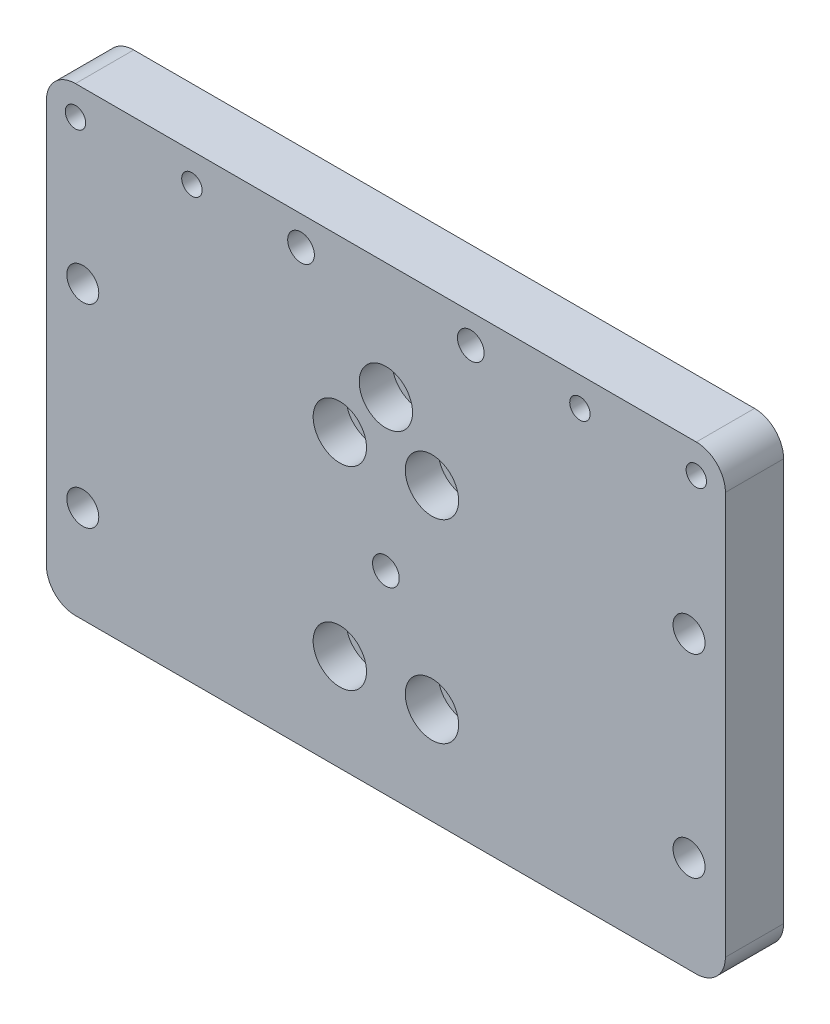
ISO-10303-21;
HEADER;
FILE_DESCRIPTION(('STEP AP214'),'2;1');
FILE_NAME('part.step','',(''),(''),'','','');
FILE_SCHEMA(('AUTOMOTIVE_DESIGN { 1 0 10303 214 1 1 1 1 }'));
ENDSEC;
DATA;
#1=APPLICATION_CONTEXT('core data for automotive mechanical design processes');
#2=APPLICATION_PROTOCOL_DEFINITION('international standard','automotive_design',2000,#1);
#3=PRODUCT_CONTEXT('',#1,'mechanical');
#4=PRODUCT('Part','Part','',(#3));
#5=PRODUCT_RELATED_PRODUCT_CATEGORY('part','',(#4));
#6=PRODUCT_DEFINITION_FORMATION('','',#4);
#7=PRODUCT_DEFINITION_CONTEXT('part definition',#1,'design');
#8=PRODUCT_DEFINITION('design','',#6,#7);
#9=PRODUCT_DEFINITION_SHAPE('','',#8);
#10=(LENGTH_UNIT() NAMED_UNIT(*) SI_UNIT(.MILLI.,.METRE.));
#11=(NAMED_UNIT(*) PLANE_ANGLE_UNIT() SI_UNIT($,.RADIAN.));
#12=(NAMED_UNIT(*) SI_UNIT($,.STERADIAN.) SOLID_ANGLE_UNIT());
#13=UNCERTAINTY_MEASURE_WITH_UNIT(LENGTH_MEASURE(1.E-05),#10,'distance_accuracy_value','');
#14=(GEOMETRIC_REPRESENTATION_CONTEXT(3) GLOBAL_UNCERTAINTY_ASSIGNED_CONTEXT((#13)) GLOBAL_UNIT_ASSIGNED_CONTEXT((#10,
#11,#12)) REPRESENTATION_CONTEXT('',''));
#15=CARTESIAN_POINT('',(0.,0.,0.));
#16=DIRECTION('',(0.,0.,1.));
#17=DIRECTION('',(1.,0.,0.));
#18=AXIS2_PLACEMENT_3D('',#15,#16,#17);
#19=CARTESIAN_POINT('',(0.,23.5,-6.));
#20=DIRECTION('',(0.,0.,1.));
#21=DIRECTION('',(1.,0.,0.));
#22=AXIS2_PLACEMENT_3D('',#19,#20,#21);
#23=CYLINDRICAL_SURFACE('',#22,2.75);
#24=CARTESIAN_POINT('',(0.,23.5,-6.));
#25=DIRECTION('',(0.,0.,1.));
#26=DIRECTION('',(1.,0.,0.));
#27=AXIS2_PLACEMENT_3D('',#24,#25,#26);
#28=CIRCLE('',#27,2.75);
#29=CARTESIAN_POINT('',(2.75000000000001,23.5,-6.));
#30=VERTEX_POINT('',#29);
#31=EDGE_CURVE('E184',#30,#30,#28,.T.);
#32=ORIENTED_EDGE('',*,*,#31,.F.);
#33=EDGE_LOOP('',(#32));
#34=FACE_BOUND('',#33,.T.);
#35=CARTESIAN_POINT('',(0.,23.5,-0.799999999999999));
#36=DIRECTION('',(0.,0.,1.));
#37=DIRECTION('',(1.,0.,0.));
#38=AXIS2_PLACEMENT_3D('',#35,#36,#37);
#39=CIRCLE('',#38,2.75);
#40=CARTESIAN_POINT('',(2.75000000000001,23.5,-0.799999999999999));
#41=VERTEX_POINT('',#40);
#42=EDGE_CURVE('E150',#41,#41,#39,.F.);
#43=ORIENTED_EDGE('',*,*,#42,.F.);
#44=EDGE_LOOP('',(#43));
#45=FACE_BOUND('',#44,.T.);
#46=ADVANCED_FACE('F35',(#34,#45),#23,.F.);
#47=CARTESIAN_POINT('',(-9.49999999999999,12.5,-6.));
#48=DIRECTION('',(0.,0.,1.));
#49=DIRECTION('',(1.,0.,0.));
#50=AXIS2_PLACEMENT_3D('',#47,#48,#49);
#51=CYLINDRICAL_SURFACE('',#50,3.3);
#52=CARTESIAN_POINT('',(-9.49999999999999,12.5,-6.));
#53=DIRECTION('',(0.,0.,1.));
#54=DIRECTION('',(1.,0.,0.));
#55=AXIS2_PLACEMENT_3D('',#52,#53,#54);
#56=CIRCLE('',#55,3.3);
#57=CARTESIAN_POINT('',(-6.19999999999999,12.5,-6.));
#58=VERTEX_POINT('',#57);
#59=EDGE_CURVE('E223',#58,#58,#56,.T.);
#60=ORIENTED_EDGE('',*,*,#59,.F.);
#61=EDGE_LOOP('',(#60));
#62=FACE_BOUND('',#61,.T.);
#63=CARTESIAN_POINT('',(-9.49999999999999,12.5,-0.799999999999999));
#64=DIRECTION('',(0.,0.,1.));
#65=DIRECTION('',(1.,0.,0.));
#66=AXIS2_PLACEMENT_3D('',#63,#64,#65);
#67=CIRCLE('',#66,3.3);
#68=CARTESIAN_POINT('',(-6.19999999999999,12.5,-0.799999999999999));
#69=VERTEX_POINT('',#68);
#70=EDGE_CURVE('E147',#69,#69,#67,.F.);
#71=ORIENTED_EDGE('',*,*,#70,.F.);
#72=EDGE_LOOP('',(#71));
#73=FACE_BOUND('',#72,.T.);
#74=ADVANCED_FACE('F355',(#62,#73),#51,.F.);
#75=CARTESIAN_POINT('',(9.50000000000001,12.5,-6.));
#76=DIRECTION('',(0.,0.,1.));
#77=DIRECTION('',(1.,0.,0.));
#78=AXIS2_PLACEMENT_3D('',#75,#76,#77);
#79=CYLINDRICAL_SURFACE('',#78,3.3);
#80=CARTESIAN_POINT('',(9.50000000000001,12.5,-6.));
#81=DIRECTION('',(0.,0.,1.));
#82=DIRECTION('',(-1.,0.,0.));
#83=AXIS2_PLACEMENT_3D('',#80,#81,#82);
#84=CIRCLE('',#83,3.3);
#85=CARTESIAN_POINT('',(6.20000000000001,12.5,-6.));
#86=VERTEX_POINT('',#85);
#87=EDGE_CURVE('E138',#86,#86,#84,.T.);
#88=ORIENTED_EDGE('',*,*,#87,.F.);
#89=EDGE_LOOP('',(#88));
#90=FACE_BOUND('',#89,.T.);
#91=CARTESIAN_POINT('',(9.50000000000001,12.5,-0.799999999999999));
#92=DIRECTION('',(0.,0.,1.));
#93=DIRECTION('',(1.,0.,0.));
#94=AXIS2_PLACEMENT_3D('',#91,#92,#93);
#95=CIRCLE('',#94,3.3);
#96=CARTESIAN_POINT('',(12.8,12.5,-0.799999999999999));
#97=VERTEX_POINT('',#96);
#98=EDGE_CURVE('E143',#97,#97,#95,.F.);
#99=ORIENTED_EDGE('',*,*,#98,.F.);
#100=EDGE_LOOP('',(#99));
#101=FACE_BOUND('',#100,.T.);
#102=ADVANCED_FACE('F361',(#90,#101),#79,.F.);
#103=CARTESIAN_POINT('',(9.50000000000001,-27.5,-6.));
#104=DIRECTION('',(0.,0.,1.));
#105=DIRECTION('',(1.,0.,0.));
#106=AXIS2_PLACEMENT_3D('',#103,#104,#105);
#107=CYLINDRICAL_SURFACE('',#106,3.3);
#108=CARTESIAN_POINT('',(9.50000000000001,-27.5,-6.));
#109=DIRECTION('',(0.,0.,1.));
#110=DIRECTION('',(-1.,0.,0.));
#111=AXIS2_PLACEMENT_3D('',#108,#109,#110);
#112=CIRCLE('',#111,3.3);
#113=CARTESIAN_POINT('',(6.20000000000001,-27.5,-6.));
#114=VERTEX_POINT('',#113);
#115=EDGE_CURVE('E257',#114,#114,#112,.T.);
#116=ORIENTED_EDGE('',*,*,#115,.F.);
#117=EDGE_LOOP('',(#116));
#118=FACE_BOUND('',#117,.T.);
#119=CARTESIAN_POINT('',(9.50000000000001,-27.5,-0.799999999999999));
#120=DIRECTION('',(0.,0.,1.));
#121=DIRECTION('',(1.,0.,0.));
#122=AXIS2_PLACEMENT_3D('',#119,#120,#121);
#123=CIRCLE('',#122,3.3);
#124=CARTESIAN_POINT('',(12.8,-27.5,-0.799999999999999));
#125=VERTEX_POINT('',#124);
#126=EDGE_CURVE('E140',#125,#125,#123,.F.);
#127=ORIENTED_EDGE('',*,*,#126,.F.);
#128=EDGE_LOOP('',(#127));
#129=FACE_BOUND('',#128,.T.);
#130=ADVANCED_FACE('F513',(#118,#129),#107,.F.);
#131=CARTESIAN_POINT('',(-9.49999999999999,-27.5,-6.));
#132=DIRECTION('',(0.,0.,1.));
#133=DIRECTION('',(1.,0.,0.));
#134=AXIS2_PLACEMENT_3D('',#131,#132,#133);
#135=CYLINDRICAL_SURFACE('',#134,3.3);
#136=CARTESIAN_POINT('',(-9.49999999999999,-27.5,-6.));
#137=DIRECTION('',(0.,0.,1.));
#138=DIRECTION('',(1.,0.,0.));
#139=AXIS2_PLACEMENT_3D('',#136,#137,#138);
#140=CIRCLE('',#139,3.3);
#141=CARTESIAN_POINT('',(-6.19999999999999,-27.5,-6.));
#142=VERTEX_POINT('',#141);
#143=EDGE_CURVE('E220',#142,#142,#140,.T.);
#144=ORIENTED_EDGE('',*,*,#143,.F.);
#145=EDGE_LOOP('',(#144));
#146=FACE_BOUND('',#145,.T.);
#147=CARTESIAN_POINT('',(-9.49999999999999,-27.5,-0.799999999999999));
#148=DIRECTION('',(0.,0.,1.));
#149=DIRECTION('',(1.,0.,0.));
#150=AXIS2_PLACEMENT_3D('',#147,#148,#149);
#151=CIRCLE('',#150,3.3);
#152=CARTESIAN_POINT('',(-6.19999999999999,-27.5,-0.799999999999999));
#153=VERTEX_POINT('',#152);
#154=EDGE_CURVE('E135',#153,#153,#151,.F.);
#155=ORIENTED_EDGE('',*,*,#154,.F.);
#156=EDGE_LOOP('',(#155));
#157=FACE_BOUND('',#156,.T.);
#158=ADVANCED_FACE('F382',(#146,#157),#135,.F.);
#159=CARTESIAN_POINT('',(-70.,-47.5,6.));
#160=DIRECTION('',(1.,0.,0.));
#161=DIRECTION('',(0.,0.,-1.));
#162=AXIS2_PLACEMENT_3D('',#159,#160,#161);
#163=PLANE('',#162);
#164=DIRECTION('',(0.,-1.,0.));
#165=VECTOR('',#164,1.);
#166=CARTESIAN_POINT('',(-70.,-47.5,-6.));
#167=LINE('',#166,#165);
#168=CARTESIAN_POINT('',(-70.,41.5,-6.));
#169=VERTEX_POINT('',#168);
#170=CARTESIAN_POINT('',(-70.,-41.5,-6.));
#171=VERTEX_POINT('',#170);
#172=EDGE_CURVE('E131',#169,#171,#167,.T.);
#173=ORIENTED_EDGE('',*,*,#172,.T.);
#174=DIRECTION('',(0.,0.,-1.));
#175=VECTOR('',#174,1.);
#176=CARTESIAN_POINT('',(-70.,-41.5,6.));
#177=LINE('',#176,#175);
#178=CARTESIAN_POINT('',(-70.,-41.5,6.));
#179=VERTEX_POINT('',#178);
#180=EDGE_CURVE('E11',#171,#179,#177,.F.);
#181=ORIENTED_EDGE('',*,*,#180,.T.);
#182=DIRECTION('',(0.,-1.,0.));
#183=VECTOR('',#182,1.);
#184=CARTESIAN_POINT('',(-70.,-47.5,6.));
#185=LINE('',#184,#183);
#186=CARTESIAN_POINT('',(-70.,41.5,6.));
#187=VERTEX_POINT('',#186);
#188=EDGE_CURVE('E129',#187,#179,#185,.T.);
#189=ORIENTED_EDGE('',*,*,#188,.F.);
#190=DIRECTION('',(0.,0.,-1.));
#191=VECTOR('',#190,1.);
#192=CARTESIAN_POINT('',(-70.,41.5,6.));
#193=LINE('',#192,#191);
#194=EDGE_CURVE('E43',#187,#169,#193,.T.);
#195=ORIENTED_EDGE('',*,*,#194,.T.);
#196=EDGE_LOOP('',(#173,#181,#189,#195));
#197=FACE_BOUND('',#196,.T.);
#198=ADVANCED_FACE('F179',(#197),#163,.F.);
#199=CARTESIAN_POINT('',(70.,-47.5,6.));
#200=DIRECTION('',(0.,1.,0.));
#201=DIRECTION('',(-1.,0.,0.));
#202=AXIS2_PLACEMENT_3D('',#199,#200,#201);
#203=PLANE('',#202);
#204=DIRECTION('',(1.,0.,0.));
#205=VECTOR('',#204,1.);
#206=CARTESIAN_POINT('',(70.,-47.5,-6.));
#207=LINE('',#206,#205);
#208=CARTESIAN_POINT('',(-64.,-47.5,-6.));
#209=VERTEX_POINT('',#208);
#210=CARTESIAN_POINT('',(64.,-47.5,-6.));
#211=VERTEX_POINT('',#210);
#212=EDGE_CURVE('E127',#209,#211,#207,.T.);
#213=ORIENTED_EDGE('',*,*,#212,.T.);
#214=DIRECTION('',(0.,0.,-1.));
#215=VECTOR('',#214,1.);
#216=CARTESIAN_POINT('',(64.,-47.5,6.));
#217=LINE('',#216,#215);
#218=CARTESIAN_POINT('',(64.,-47.5,6.));
#219=VERTEX_POINT('',#218);
#220=EDGE_CURVE('E106',#211,#219,#217,.F.);
#221=ORIENTED_EDGE('',*,*,#220,.T.);
#222=DIRECTION('',(1.,0.,0.));
#223=VECTOR('',#222,1.);
#224=CARTESIAN_POINT('',(70.,-47.5,6.));
#225=LINE('',#224,#223);
#226=CARTESIAN_POINT('',(-64.,-47.5,6.));
#227=VERTEX_POINT('',#226);
#228=EDGE_CURVE('E191',#227,#219,#225,.T.);
#229=ORIENTED_EDGE('',*,*,#228,.F.);
#230=DIRECTION('',(0.,0.,-1.));
#231=VECTOR('',#230,1.);
#232=CARTESIAN_POINT('',(-64.,-47.5,6.));
#233=LINE('',#232,#231);
#234=EDGE_CURVE('E111',#227,#209,#233,.T.);
#235=ORIENTED_EDGE('',*,*,#234,.T.);
#236=EDGE_LOOP('',(#213,#221,#229,#235));
#237=FACE_BOUND('',#236,.T.);
#238=ADVANCED_FACE('F346',(#237),#203,.F.);
#239=CARTESIAN_POINT('',(70.,-47.5,6.));
#240=DIRECTION('',(-1.,0.,0.));
#241=DIRECTION('',(0.,0.,1.));
#242=AXIS2_PLACEMENT_3D('',#239,#240,#241);
#243=PLANE('',#242);
#244=DIRECTION('',(0.,1.,0.));
#245=VECTOR('',#244,1.);
#246=CARTESIAN_POINT('',(70.,-47.5,6.));
#247=LINE('',#246,#245);
#248=CARTESIAN_POINT('',(70.,-41.5,6.));
#249=VERTEX_POINT('',#248);
#250=CARTESIAN_POINT('',(70.,41.5,6.));
#251=VERTEX_POINT('',#250);
#252=EDGE_CURVE('E120',#249,#251,#247,.T.);
#253=ORIENTED_EDGE('',*,*,#252,.F.);
#254=DIRECTION('',(0.,0.,-1.));
#255=VECTOR('',#254,1.);
#256=CARTESIAN_POINT('',(70.,-41.5,6.));
#257=LINE('',#256,#255);
#258=CARTESIAN_POINT('',(70.,-41.5,-6.));
#259=VERTEX_POINT('',#258);
#260=EDGE_CURVE('E105',#249,#259,#257,.T.);
#261=ORIENTED_EDGE('',*,*,#260,.T.);
#262=DIRECTION('',(0.,1.,0.));
#263=VECTOR('',#262,1.);
#264=CARTESIAN_POINT('',(70.,-47.5,-6.));
#265=LINE('',#264,#263);
#266=CARTESIAN_POINT('',(70.,41.5,-6.));
#267=VERTEX_POINT('',#266);
#268=EDGE_CURVE('E118',#259,#267,#265,.T.);
#269=ORIENTED_EDGE('',*,*,#268,.T.);
#270=DIRECTION('',(0.,0.,-1.));
#271=VECTOR('',#270,1.);
#272=CARTESIAN_POINT('',(70.,41.5,6.));
#273=LINE('',#272,#271);
#274=EDGE_CURVE('E122',#267,#251,#273,.F.);
#275=ORIENTED_EDGE('',*,*,#274,.T.);
#276=EDGE_LOOP('',(#253,#261,#269,#275));
#277=FACE_BOUND('',#276,.T.);
#278=ADVANCED_FACE('F117',(#277),#243,.F.);
#279=CARTESIAN_POINT('',(70.,47.5,6.));
#280=DIRECTION('',(0.,-1.,0.));
#281=DIRECTION('',(1.,0.,0.));
#282=AXIS2_PLACEMENT_3D('',#279,#280,#281);
#283=PLANE('',#282);
#284=DIRECTION('',(-1.,0.,0.));
#285=VECTOR('',#284,1.);
#286=CARTESIAN_POINT('',(70.,47.5,6.));
#287=LINE('',#286,#285);
#288=CARTESIAN_POINT('',(64.,47.5,6.));
#289=VERTEX_POINT('',#288);
#290=CARTESIAN_POINT('',(-64.,47.5,6.));
#291=VERTEX_POINT('',#290);
#292=EDGE_CURVE('E154',#289,#291,#287,.T.);
#293=ORIENTED_EDGE('',*,*,#292,.F.);
#294=DIRECTION('',(0.,0.,-1.));
#295=VECTOR('',#294,1.);
#296=CARTESIAN_POINT('',(64.,47.5,6.));
#297=LINE('',#296,#295);
#298=CARTESIAN_POINT('',(64.,47.5,-6.));
#299=VERTEX_POINT('',#298);
#300=EDGE_CURVE('E171',#289,#299,#297,.T.);
#301=ORIENTED_EDGE('',*,*,#300,.T.);
#302=DIRECTION('',(-1.,0.,0.));
#303=VECTOR('',#302,1.);
#304=CARTESIAN_POINT('',(70.,47.5,-6.));
#305=LINE('',#304,#303);
#306=CARTESIAN_POINT('',(-64.,47.5,-6.));
#307=VERTEX_POINT('',#306);
#308=EDGE_CURVE('E126',#299,#307,#305,.T.);
#309=ORIENTED_EDGE('',*,*,#308,.T.);
#310=DIRECTION('',(0.,0.,-1.));
#311=VECTOR('',#310,1.);
#312=CARTESIAN_POINT('',(-64.,47.5,6.));
#313=LINE('',#312,#311);
#314=EDGE_CURVE('E50',#307,#291,#313,.F.);
#315=ORIENTED_EDGE('',*,*,#314,.T.);
#316=EDGE_LOOP('',(#293,#301,#309,#315));
#317=FACE_BOUND('',#316,.T.);
#318=ADVANCED_FACE('F312',(#317),#283,.F.);
#319=CARTESIAN_POINT('',(0.,0.,6.));
#320=DIRECTION('',(0.,0.,1.));
#321=DIRECTION('',(1.,0.,0.));
#322=AXIS2_PLACEMENT_3D('',#319,#320,#321);
#323=PLANE('',#322);
#324=CARTESIAN_POINT('',(0.,23.5,6.));
#325=DIRECTION('',(0.,0.,1.));
#326=DIRECTION('',(1.,0.,0.));
#327=AXIS2_PLACEMENT_3D('',#324,#325,#326);
#328=CIRCLE('',#327,5.5);
#329=CARTESIAN_POINT('',(5.50000000000001,23.5,6.));
#330=VERTEX_POINT('',#329);
#331=EDGE_CURVE('E287',#330,#330,#328,.T.);
#332=ORIENTED_EDGE('',*,*,#331,.F.);
#333=EDGE_LOOP('',(#332));
#334=FACE_BOUND('',#333,.T.);
#335=CARTESIAN_POINT('',(-9.49999999999999,12.5,6.));
#336=DIRECTION('',(0.,0.,1.));
#337=DIRECTION('',(1.,0.,0.));
#338=AXIS2_PLACEMENT_3D('',#335,#336,#337);
#339=CIRCLE('',#338,5.5);
#340=CARTESIAN_POINT('',(-3.99999999999999,12.5,6.));
#341=VERTEX_POINT('',#340);
#342=EDGE_CURVE('E293',#341,#341,#339,.T.);
#343=ORIENTED_EDGE('',*,*,#342,.F.);
#344=EDGE_LOOP('',(#343));
#345=FACE_BOUND('',#344,.T.);
#346=CARTESIAN_POINT('',(9.50000000000001,12.5,6.));
#347=DIRECTION('',(0.,0.,1.));
#348=DIRECTION('',(1.,0.,0.));
#349=AXIS2_PLACEMENT_3D('',#346,#347,#348);
#350=CIRCLE('',#349,5.5);
#351=CARTESIAN_POINT('',(15.,12.5,6.));
#352=VERTEX_POINT('',#351);
#353=EDGE_CURVE('E275',#352,#352,#350,.T.);
#354=ORIENTED_EDGE('',*,*,#353,.F.);
#355=EDGE_LOOP('',(#354));
#356=FACE_BOUND('',#355,.T.);
#357=CARTESIAN_POINT('',(9.50000000000001,-27.5,6.));
#358=DIRECTION('',(0.,0.,1.));
#359=DIRECTION('',(1.,0.,0.));
#360=AXIS2_PLACEMENT_3D('',#357,#358,#359);
#361=CIRCLE('',#360,5.5);
#362=CARTESIAN_POINT('',(15.,-27.5,6.));
#363=VERTEX_POINT('',#362);
#364=EDGE_CURVE('E282',#363,#363,#361,.T.);
#365=ORIENTED_EDGE('',*,*,#364,.F.);
#366=EDGE_LOOP('',(#365));
#367=FACE_BOUND('',#366,.T.);
#368=CARTESIAN_POINT('',(-9.49999999999999,-27.5,6.));
#369=DIRECTION('',(0.,0.,1.));
#370=DIRECTION('',(1.,0.,0.));
#371=AXIS2_PLACEMENT_3D('',#368,#369,#370);
#372=CIRCLE('',#371,5.5);
#373=CARTESIAN_POINT('',(-3.99999999999999,-27.5,6.));
#374=VERTEX_POINT('',#373);
#375=EDGE_CURVE('E153',#374,#374,#372,.T.);
#376=ORIENTED_EDGE('',*,*,#375,.F.);
#377=EDGE_LOOP('',(#376));
#378=FACE_BOUND('',#377,.T.);
#379=CARTESIAN_POINT('',(-62.5,-27.5,6.));
#380=DIRECTION('',(0.,0.,1.));
#381=DIRECTION('',(1.,0.,0.));
#382=AXIS2_PLACEMENT_3D('',#379,#380,#381);
#383=CIRCLE('',#382,3.3);
#384=CARTESIAN_POINT('',(-59.2,-27.5,6.));
#385=VERTEX_POINT('',#384);
#386=EDGE_CURVE('E250',#385,#385,#383,.T.);
#387=ORIENTED_EDGE('',*,*,#386,.F.);
#388=EDGE_LOOP('',(#387));
#389=FACE_BOUND('',#388,.T.);
#390=CARTESIAN_POINT('',(62.5000000000001,-27.5,6.));
#391=DIRECTION('',(0.,0.,1.));
#392=DIRECTION('',(-1.,0.,0.));
#393=AXIS2_PLACEMENT_3D('',#390,#391,#392);
#394=CIRCLE('',#393,3.3);
#395=CARTESIAN_POINT('',(59.2000000000001,-27.5,6.));
#396=VERTEX_POINT('',#395);
#397=EDGE_CURVE('E244',#396,#396,#394,.T.);
#398=ORIENTED_EDGE('',*,*,#397,.F.);
#399=EDGE_LOOP('',(#398));
#400=FACE_BOUND('',#399,.T.);
#401=CARTESIAN_POINT('',(62.5,12.5,6.));
#402=DIRECTION('',(0.,0.,1.));
#403=DIRECTION('',(-1.,0.,0.));
#404=AXIS2_PLACEMENT_3D('',#401,#402,#403);
#405=CIRCLE('',#404,3.3);
#406=CARTESIAN_POINT('',(59.2,12.5,6.));
#407=VERTEX_POINT('',#406);
#408=EDGE_CURVE('E238',#407,#407,#405,.T.);
#409=ORIENTED_EDGE('',*,*,#408,.F.);
#410=EDGE_LOOP('',(#409));
#411=FACE_BOUND('',#410,.T.);
#412=CARTESIAN_POINT('',(64.,41.5,6.));
#413=DIRECTION('',(0.,0.,1.));
#414=DIRECTION('',(-1.,0.,0.));
#415=AXIS2_PLACEMENT_3D('',#412,#413,#414);
#416=CIRCLE('',#415,2.1);
#417=CARTESIAN_POINT('',(61.9,41.5,6.));
#418=VERTEX_POINT('',#417);
#419=EDGE_CURVE('E231',#418,#418,#416,.T.);
#420=ORIENTED_EDGE('',*,*,#419,.F.);
#421=EDGE_LOOP('',(#420));
#422=FACE_BOUND('',#421,.T.);
#423=CARTESIAN_POINT('',(40.,41.5,6.));
#424=DIRECTION('',(0.,0.,1.));
#425=DIRECTION('',(-1.,0.,0.));
#426=AXIS2_PLACEMENT_3D('',#423,#424,#425);
#427=CIRCLE('',#426,2.1);
#428=CARTESIAN_POINT('',(37.9,41.5,6.));
#429=VERTEX_POINT('',#428);
#430=EDGE_CURVE('E266',#429,#429,#427,.T.);
#431=ORIENTED_EDGE('',*,*,#430,.F.);
#432=EDGE_LOOP('',(#431));
#433=FACE_BOUND('',#432,.T.);
#434=CARTESIAN_POINT('',(17.5,41.5,6.));
#435=DIRECTION('',(0.,0.,1.));
#436=DIRECTION('',(-1.,0.,0.));
#437=AXIS2_PLACEMENT_3D('',#434,#435,#436);
#438=CIRCLE('',#437,2.75);
#439=CARTESIAN_POINT('',(14.75,41.5,6.));
#440=VERTEX_POINT('',#439);
#441=EDGE_CURVE('E260',#440,#440,#438,.T.);
#442=ORIENTED_EDGE('',*,*,#441,.F.);
#443=EDGE_LOOP('',(#442));
#444=FACE_BOUND('',#443,.T.);
#445=CARTESIAN_POINT('',(-62.5,12.5,6.));
#446=DIRECTION('',(0.,0.,1.));
#447=DIRECTION('',(1.,0.,0.));
#448=AXIS2_PLACEMENT_3D('',#445,#446,#447);
#449=CIRCLE('',#448,3.3);
#450=CARTESIAN_POINT('',(-59.2,12.5,6.));
#451=VERTEX_POINT('',#450);
#452=EDGE_CURVE('E195',#451,#451,#449,.T.);
#453=ORIENTED_EDGE('',*,*,#452,.F.);
#454=EDGE_LOOP('',(#453));
#455=FACE_BOUND('',#454,.T.);
#456=CARTESIAN_POINT('',(-64.,41.5,6.));
#457=DIRECTION('',(0.,0.,1.));
#458=DIRECTION('',(1.,0.,0.));
#459=AXIS2_PLACEMENT_3D('',#456,#457,#458);
#460=CIRCLE('',#459,2.1);
#461=CARTESIAN_POINT('',(-61.9,41.5,6.));
#462=VERTEX_POINT('',#461);
#463=EDGE_CURVE('E202',#462,#462,#460,.T.);
#464=ORIENTED_EDGE('',*,*,#463,.F.);
#465=EDGE_LOOP('',(#464));
#466=FACE_BOUND('',#465,.T.);
#467=CARTESIAN_POINT('',(-40.,41.5,6.));
#468=DIRECTION('',(0.,0.,1.));
#469=DIRECTION('',(1.,0.,0.));
#470=AXIS2_PLACEMENT_3D('',#467,#468,#469);
#471=CIRCLE('',#470,2.1);
#472=CARTESIAN_POINT('',(-37.9,41.5,6.));
#473=VERTEX_POINT('',#472);
#474=EDGE_CURVE('E208',#473,#473,#471,.T.);
#475=ORIENTED_EDGE('',*,*,#474,.F.);
#476=EDGE_LOOP('',(#475));
#477=FACE_BOUND('',#476,.T.);
#478=CARTESIAN_POINT('',(-17.5,41.5,6.));
#479=DIRECTION('',(0.,0.,1.));
#480=DIRECTION('',(1.,0.,0.));
#481=AXIS2_PLACEMENT_3D('',#478,#479,#480);
#482=CIRCLE('',#481,2.75);
#483=CARTESIAN_POINT('',(-14.75,41.5,6.));
#484=VERTEX_POINT('',#483);
#485=EDGE_CURVE('E214',#484,#484,#482,.T.);
#486=ORIENTED_EDGE('',*,*,#485,.F.);
#487=EDGE_LOOP('',(#486));
#488=FACE_BOUND('',#487,.T.);
#489=CARTESIAN_POINT('',(0.,-7.49999999999999,6.));
#490=DIRECTION('',(0.,0.,1.));
#491=DIRECTION('',(1.,0.,0.));
#492=AXIS2_PLACEMENT_3D('',#489,#490,#491);
#493=CIRCLE('',#492,2.75);
#494=CARTESIAN_POINT('',(2.75000000000001,-7.49999999999999,6.));
#495=VERTEX_POINT('',#494);
#496=EDGE_CURVE('E226',#495,#495,#493,.T.);
#497=ORIENTED_EDGE('',*,*,#496,.F.);
#498=EDGE_LOOP('',(#497));
#499=FACE_BOUND('',#498,.T.);
#500=ORIENTED_EDGE('',*,*,#228,.T.);
#501=CARTESIAN_POINT('',(64.,-41.5,6.));
#502=DIRECTION('',(0.,0.,1.));
#503=DIRECTION('',(1.,0.,0.));
#504=AXIS2_PLACEMENT_3D('',#501,#502,#503);
#505=CIRCLE('',#504,6.);
#506=EDGE_CURVE('E168',#219,#249,#505,.T.);
#507=ORIENTED_EDGE('',*,*,#506,.T.);
#508=ORIENTED_EDGE('',*,*,#252,.T.);
#509=CARTESIAN_POINT('',(64.,41.5,6.));
#510=DIRECTION('',(0.,0.,1.));
#511=DIRECTION('',(1.,0.,0.));
#512=AXIS2_PLACEMENT_3D('',#509,#510,#511);
#513=CIRCLE('',#512,6.);
#514=EDGE_CURVE('E57',#251,#289,#513,.T.);
#515=ORIENTED_EDGE('',*,*,#514,.T.);
#516=ORIENTED_EDGE('',*,*,#292,.T.);
#517=CARTESIAN_POINT('',(-64.,41.5,6.));
#518=DIRECTION('',(0.,0.,1.));
#519=DIRECTION('',(1.,0.,0.));
#520=AXIS2_PLACEMENT_3D('',#517,#518,#519);
#521=CIRCLE('',#520,6.);
#522=EDGE_CURVE('E163',#291,#187,#521,.T.);
#523=ORIENTED_EDGE('',*,*,#522,.T.);
#524=ORIENTED_EDGE('',*,*,#188,.T.);
#525=CARTESIAN_POINT('',(-64.,-41.5,6.));
#526=DIRECTION('',(0.,0.,1.));
#527=DIRECTION('',(1.,0.,0.));
#528=AXIS2_PLACEMENT_3D('',#525,#526,#527);
#529=CIRCLE('',#528,6.);
#530=EDGE_CURVE('E165',#179,#227,#529,.T.);
#531=ORIENTED_EDGE('',*,*,#530,.T.);
#532=EDGE_LOOP('',(#500,#507,#508,#515,#516,#523,#524,#531));
#533=FACE_BOUND('',#532,.T.);
#534=ADVANCED_FACE('F309',(#334,#345,#356,#367,#378,#389,#400,#411,#422,#433,#444,#455,#466,
#477,#488,#499,#533),#323,.T.);
#535=CARTESIAN_POINT('',(0.,0.,-6.));
#536=DIRECTION('',(0.,0.,1.));
#537=DIRECTION('',(1.,0.,0.));
#538=AXIS2_PLACEMENT_3D('',#535,#536,#537);
#539=PLANE('',#538);
#540=CARTESIAN_POINT('',(-62.5,-27.5,-6.));
#541=DIRECTION('',(0.,0.,1.));
#542=DIRECTION('',(1.,0.,0.));
#543=AXIS2_PLACEMENT_3D('',#540,#541,#542);
#544=CIRCLE('',#543,3.3);
#545=CARTESIAN_POINT('',(-59.2,-27.5,-6.));
#546=VERTEX_POINT('',#545);
#547=EDGE_CURVE('E199',#546,#546,#544,.T.);
#548=ORIENTED_EDGE('',*,*,#547,.T.);
#549=EDGE_LOOP('',(#548));
#550=FACE_BOUND('',#549,.T.);
#551=CARTESIAN_POINT('',(62.5000000000001,-27.5,-6.));
#552=DIRECTION('',(0.,0.,1.));
#553=DIRECTION('',(-1.,0.,0.));
#554=AXIS2_PLACEMENT_3D('',#551,#552,#553);
#555=CIRCLE('',#554,3.3);
#556=CARTESIAN_POINT('',(59.2000000000001,-27.5,-6.));
#557=VERTEX_POINT('',#556);
#558=EDGE_CURVE('E247',#557,#557,#555,.T.);
#559=ORIENTED_EDGE('',*,*,#558,.T.);
#560=EDGE_LOOP('',(#559));
#561=FACE_BOUND('',#560,.T.);
#562=CARTESIAN_POINT('',(62.5,12.5,-6.));
#563=DIRECTION('',(0.,0.,1.));
#564=DIRECTION('',(-1.,0.,0.));
#565=AXIS2_PLACEMENT_3D('',#562,#563,#564);
#566=CIRCLE('',#565,3.3);
#567=CARTESIAN_POINT('',(59.2,12.5,-6.));
#568=VERTEX_POINT('',#567);
#569=EDGE_CURVE('E241',#568,#568,#566,.T.);
#570=ORIENTED_EDGE('',*,*,#569,.T.);
#571=EDGE_LOOP('',(#570));
#572=FACE_BOUND('',#571,.T.);
#573=CARTESIAN_POINT('',(64.,41.5,-6.));
#574=DIRECTION('',(0.,0.,1.));
#575=DIRECTION('',(-1.,0.,0.));
#576=AXIS2_PLACEMENT_3D('',#573,#574,#575);
#577=CIRCLE('',#576,2.1);
#578=CARTESIAN_POINT('',(61.9,41.5,-6.));
#579=VERTEX_POINT('',#578);
#580=EDGE_CURVE('E234',#579,#579,#577,.T.);
#581=ORIENTED_EDGE('',*,*,#580,.T.);
#582=EDGE_LOOP('',(#581));
#583=FACE_BOUND('',#582,.T.);
#584=CARTESIAN_POINT('',(40.,41.5,-6.));
#585=DIRECTION('',(0.,0.,1.));
#586=DIRECTION('',(-1.,0.,0.));
#587=AXIS2_PLACEMENT_3D('',#584,#585,#586);
#588=CIRCLE('',#587,2.1);
#589=CARTESIAN_POINT('',(37.9,41.5,-6.));
#590=VERTEX_POINT('',#589);
#591=EDGE_CURVE('E235',#590,#590,#588,.T.);
#592=ORIENTED_EDGE('',*,*,#591,.T.);
#593=EDGE_LOOP('',(#592));
#594=FACE_BOUND('',#593,.T.);
#595=CARTESIAN_POINT('',(17.5,41.5,-6.));
#596=DIRECTION('',(0.,0.,1.));
#597=DIRECTION('',(-1.,0.,0.));
#598=AXIS2_PLACEMENT_3D('',#595,#596,#597);
#599=CIRCLE('',#598,2.75);
#600=CARTESIAN_POINT('',(14.75,41.5,-6.));
#601=VERTEX_POINT('',#600);
#602=EDGE_CURVE('E263',#601,#601,#599,.T.);
#603=ORIENTED_EDGE('',*,*,#602,.T.);
#604=EDGE_LOOP('',(#603));
#605=FACE_BOUND('',#604,.T.);
#606=ORIENTED_EDGE('',*,*,#115,.T.);
#607=EDGE_LOOP('',(#606));
#608=FACE_BOUND('',#607,.T.);
#609=ORIENTED_EDGE('',*,*,#87,.T.);
#610=EDGE_LOOP('',(#609));
#611=FACE_BOUND('',#610,.T.);
#612=CARTESIAN_POINT('',(-62.5,12.5,-6.));
#613=DIRECTION('',(0.,0.,1.));
#614=DIRECTION('',(1.,0.,0.));
#615=AXIS2_PLACEMENT_3D('',#612,#613,#614);
#616=CIRCLE('',#615,3.3);
#617=CARTESIAN_POINT('',(-59.2,12.5,-6.));
#618=VERTEX_POINT('',#617);
#619=EDGE_CURVE('E198',#618,#618,#616,.T.);
#620=ORIENTED_EDGE('',*,*,#619,.T.);
#621=EDGE_LOOP('',(#620));
#622=FACE_BOUND('',#621,.T.);
#623=CARTESIAN_POINT('',(-64.,41.5,-6.));
#624=DIRECTION('',(0.,0.,1.));
#625=DIRECTION('',(1.,0.,0.));
#626=AXIS2_PLACEMENT_3D('',#623,#624,#625);
#627=CIRCLE('',#626,2.1);
#628=CARTESIAN_POINT('',(-61.9,41.5,-6.));
#629=VERTEX_POINT('',#628);
#630=EDGE_CURVE('E205',#629,#629,#627,.T.);
#631=ORIENTED_EDGE('',*,*,#630,.T.);
#632=EDGE_LOOP('',(#631));
#633=FACE_BOUND('',#632,.T.);
#634=CARTESIAN_POINT('',(-40.,41.5,-6.));
#635=DIRECTION('',(0.,0.,1.));
#636=DIRECTION('',(1.,0.,0.));
#637=AXIS2_PLACEMENT_3D('',#634,#635,#636);
#638=CIRCLE('',#637,2.1);
#639=CARTESIAN_POINT('',(-37.9,41.5,-6.));
#640=VERTEX_POINT('',#639);
#641=EDGE_CURVE('E211',#640,#640,#638,.T.);
#642=ORIENTED_EDGE('',*,*,#641,.T.);
#643=EDGE_LOOP('',(#642));
#644=FACE_BOUND('',#643,.T.);
#645=CARTESIAN_POINT('',(-17.5,41.5,-6.));
#646=DIRECTION('',(0.,0.,1.));
#647=DIRECTION('',(1.,0.,0.));
#648=AXIS2_PLACEMENT_3D('',#645,#646,#647);
#649=CIRCLE('',#648,2.75);
#650=CARTESIAN_POINT('',(-14.75,41.5,-6.));
#651=VERTEX_POINT('',#650);
#652=EDGE_CURVE('E217',#651,#651,#649,.T.);
#653=ORIENTED_EDGE('',*,*,#652,.T.);
#654=EDGE_LOOP('',(#653));
#655=FACE_BOUND('',#654,.T.);
#656=ORIENTED_EDGE('',*,*,#143,.T.);
#657=EDGE_LOOP('',(#656));
#658=FACE_BOUND('',#657,.T.);
#659=ORIENTED_EDGE('',*,*,#59,.T.);
#660=EDGE_LOOP('',(#659));
#661=FACE_BOUND('',#660,.T.);
#662=CARTESIAN_POINT('',(0.,-7.49999999999999,-6.));
#663=DIRECTION('',(0.,0.,1.));
#664=DIRECTION('',(1.,0.,0.));
#665=AXIS2_PLACEMENT_3D('',#662,#663,#664);
#666=CIRCLE('',#665,2.75);
#667=CARTESIAN_POINT('',(2.75000000000001,-7.49999999999999,-6.));
#668=VERTEX_POINT('',#667);
#669=EDGE_CURVE('E186',#668,#668,#666,.T.);
#670=ORIENTED_EDGE('',*,*,#669,.T.);
#671=EDGE_LOOP('',(#670));
#672=FACE_BOUND('',#671,.T.);
#673=ORIENTED_EDGE('',*,*,#31,.T.);
#674=EDGE_LOOP('',(#673));
#675=FACE_BOUND('',#674,.T.);
#676=ORIENTED_EDGE('',*,*,#268,.F.);
#677=CARTESIAN_POINT('',(64.,-41.5,-6.));
#678=DIRECTION('',(0.,0.,1.));
#679=DIRECTION('',(1.,0.,0.));
#680=AXIS2_PLACEMENT_3D('',#677,#678,#679);
#681=CIRCLE('',#680,6.);
#682=EDGE_CURVE('E101',#259,#211,#681,.F.);
#683=ORIENTED_EDGE('',*,*,#682,.T.);
#684=ORIENTED_EDGE('',*,*,#212,.F.);
#685=CARTESIAN_POINT('',(-64.,-41.5,-6.));
#686=DIRECTION('',(0.,0.,1.));
#687=DIRECTION('',(1.,0.,0.));
#688=AXIS2_PLACEMENT_3D('',#685,#686,#687);
#689=CIRCLE('',#688,6.);
#690=EDGE_CURVE('E157',#209,#171,#689,.F.);
#691=ORIENTED_EDGE('',*,*,#690,.T.);
#692=ORIENTED_EDGE('',*,*,#172,.F.);
#693=CARTESIAN_POINT('',(-64.,41.5,-6.));
#694=DIRECTION('',(0.,0.,1.));
#695=DIRECTION('',(1.,0.,0.));
#696=AXIS2_PLACEMENT_3D('',#693,#694,#695);
#697=CIRCLE('',#696,6.);
#698=EDGE_CURVE('E121',#169,#307,#697,.F.);
#699=ORIENTED_EDGE('',*,*,#698,.T.);
#700=ORIENTED_EDGE('',*,*,#308,.F.);
#701=CARTESIAN_POINT('',(64.,41.5,-6.));
#702=DIRECTION('',(0.,0.,1.));
#703=DIRECTION('',(1.,0.,0.));
#704=AXIS2_PLACEMENT_3D('',#701,#702,#703);
#705=CIRCLE('',#704,6.);
#706=EDGE_CURVE('E112',#299,#267,#705,.F.);
#707=ORIENTED_EDGE('',*,*,#706,.T.);
#708=EDGE_LOOP('',(#676,#683,#684,#691,#692,#699,#700,#707));
#709=FACE_BOUND('',#708,.T.);
#710=ADVANCED_FACE('F124',(#550,#561,#572,#583,#594,#605,#608,#611,#622,#633,#644,#655,#658,
#661,#672,#675,#709),#539,.F.);
#711=CARTESIAN_POINT('',(0.,-7.49999999999999,-6.));
#712=DIRECTION('',(0.,0.,1.));
#713=DIRECTION('',(1.,0.,0.));
#714=AXIS2_PLACEMENT_3D('',#711,#712,#713);
#715=CYLINDRICAL_SURFACE('',#714,2.75);
#716=ORIENTED_EDGE('',*,*,#669,.F.);
#717=EDGE_LOOP('',(#716));
#718=FACE_BOUND('',#717,.T.);
#719=ORIENTED_EDGE('',*,*,#496,.T.);
#720=EDGE_LOOP('',(#719));
#721=FACE_BOUND('',#720,.T.);
#722=ADVANCED_FACE('F372',(#718,#721),#715,.F.);
#723=CARTESIAN_POINT('',(-17.5,41.5,-6.));
#724=DIRECTION('',(0.,0.,1.));
#725=DIRECTION('',(1.,0.,0.));
#726=AXIS2_PLACEMENT_3D('',#723,#724,#725);
#727=CYLINDRICAL_SURFACE('',#726,2.75);
#728=ORIENTED_EDGE('',*,*,#652,.F.);
#729=EDGE_LOOP('',(#728));
#730=FACE_BOUND('',#729,.T.);
#731=ORIENTED_EDGE('',*,*,#485,.T.);
#732=EDGE_LOOP('',(#731));
#733=FACE_BOUND('',#732,.T.);
#734=ADVANCED_FACE('F605',(#730,#733),#727,.F.);
#735=CARTESIAN_POINT('',(-40.,41.5,-6.));
#736=DIRECTION('',(0.,0.,1.));
#737=DIRECTION('',(1.,0.,0.));
#738=AXIS2_PLACEMENT_3D('',#735,#736,#737);
#739=CYLINDRICAL_SURFACE('',#738,2.1);
#740=ORIENTED_EDGE('',*,*,#641,.F.);
#741=EDGE_LOOP('',(#740));
#742=FACE_BOUND('',#741,.T.);
#743=ORIENTED_EDGE('',*,*,#474,.T.);
#744=EDGE_LOOP('',(#743));
#745=FACE_BOUND('',#744,.T.);
#746=ADVANCED_FACE('F597',(#742,#745),#739,.F.);
#747=CARTESIAN_POINT('',(-64.,41.5,-6.));
#748=DIRECTION('',(0.,0.,1.));
#749=DIRECTION('',(1.,0.,0.));
#750=AXIS2_PLACEMENT_3D('',#747,#748,#749);
#751=CYLINDRICAL_SURFACE('',#750,2.1);
#752=ORIENTED_EDGE('',*,*,#630,.F.);
#753=EDGE_LOOP('',(#752));
#754=FACE_BOUND('',#753,.T.);
#755=ORIENTED_EDGE('',*,*,#463,.T.);
#756=EDGE_LOOP('',(#755));
#757=FACE_BOUND('',#756,.T.);
#758=ADVANCED_FACE('F589',(#754,#757),#751,.F.);
#759=CARTESIAN_POINT('',(-62.5,12.5,-6.));
#760=DIRECTION('',(0.,0.,1.));
#761=DIRECTION('',(1.,0.,0.));
#762=AXIS2_PLACEMENT_3D('',#759,#760,#761);
#763=CYLINDRICAL_SURFACE('',#762,3.3);
#764=ORIENTED_EDGE('',*,*,#619,.F.);
#765=EDGE_LOOP('',(#764));
#766=FACE_BOUND('',#765,.T.);
#767=ORIENTED_EDGE('',*,*,#452,.T.);
#768=EDGE_LOOP('',(#767));
#769=FACE_BOUND('',#768,.T.);
#770=ADVANCED_FACE('F367',(#766,#769),#763,.F.);
#771=CARTESIAN_POINT('',(17.5,41.5,-6.));
#772=DIRECTION('',(0.,0.,1.));
#773=DIRECTION('',(1.,0.,0.));
#774=AXIS2_PLACEMENT_3D('',#771,#772,#773);
#775=CYLINDRICAL_SURFACE('',#774,2.75);
#776=ORIENTED_EDGE('',*,*,#602,.F.);
#777=EDGE_LOOP('',(#776));
#778=FACE_BOUND('',#777,.T.);
#779=ORIENTED_EDGE('',*,*,#441,.T.);
#780=EDGE_LOOP('',(#779));
#781=FACE_BOUND('',#780,.T.);
#782=ADVANCED_FACE('F572',(#778,#781),#775,.F.);
#783=CARTESIAN_POINT('',(40.,41.5,-6.));
#784=DIRECTION('',(0.,0.,1.));
#785=DIRECTION('',(1.,0.,0.));
#786=AXIS2_PLACEMENT_3D('',#783,#784,#785);
#787=CYLINDRICAL_SURFACE('',#786,2.1);
#788=ORIENTED_EDGE('',*,*,#591,.F.);
#789=EDGE_LOOP('',(#788));
#790=FACE_BOUND('',#789,.T.);
#791=ORIENTED_EDGE('',*,*,#430,.T.);
#792=EDGE_LOOP('',(#791));
#793=FACE_BOUND('',#792,.T.);
#794=ADVANCED_FACE('F563',(#790,#793),#787,.F.);
#795=CARTESIAN_POINT('',(64.,41.5,-6.));
#796=DIRECTION('',(0.,0.,1.));
#797=DIRECTION('',(1.,0.,0.));
#798=AXIS2_PLACEMENT_3D('',#795,#796,#797);
#799=CYLINDRICAL_SURFACE('',#798,2.1);
#800=ORIENTED_EDGE('',*,*,#580,.F.);
#801=EDGE_LOOP('',(#800));
#802=FACE_BOUND('',#801,.T.);
#803=ORIENTED_EDGE('',*,*,#419,.T.);
#804=EDGE_LOOP('',(#803));
#805=FACE_BOUND('',#804,.T.);
#806=ADVANCED_FACE('F554',(#802,#805),#799,.F.);
#807=CARTESIAN_POINT('',(62.5,12.5,-6.));
#808=DIRECTION('',(0.,0.,1.));
#809=DIRECTION('',(1.,0.,0.));
#810=AXIS2_PLACEMENT_3D('',#807,#808,#809);
#811=CYLINDRICAL_SURFACE('',#810,3.3);
#812=ORIENTED_EDGE('',*,*,#569,.F.);
#813=EDGE_LOOP('',(#812));
#814=FACE_BOUND('',#813,.T.);
#815=ORIENTED_EDGE('',*,*,#408,.T.);
#816=EDGE_LOOP('',(#815));
#817=FACE_BOUND('',#816,.T.);
#818=ADVANCED_FACE('F545',(#814,#817),#811,.F.);
#819=CARTESIAN_POINT('',(62.5000000000001,-27.5,-6.));
#820=DIRECTION('',(0.,0.,1.));
#821=DIRECTION('',(1.,0.,0.));
#822=AXIS2_PLACEMENT_3D('',#819,#820,#821);
#823=CYLINDRICAL_SURFACE('',#822,3.3);
#824=ORIENTED_EDGE('',*,*,#558,.F.);
#825=EDGE_LOOP('',(#824));
#826=FACE_BOUND('',#825,.T.);
#827=ORIENTED_EDGE('',*,*,#397,.T.);
#828=EDGE_LOOP('',(#827));
#829=FACE_BOUND('',#828,.T.);
#830=ADVANCED_FACE('F536',(#826,#829),#823,.F.);
#831=CARTESIAN_POINT('',(-62.5,-27.5,-6.));
#832=DIRECTION('',(0.,0.,1.));
#833=DIRECTION('',(1.,0.,0.));
#834=AXIS2_PLACEMENT_3D('',#831,#832,#833);
#835=CYLINDRICAL_SURFACE('',#834,3.3);
#836=ORIENTED_EDGE('',*,*,#547,.F.);
#837=EDGE_LOOP('',(#836));
#838=FACE_BOUND('',#837,.T.);
#839=ORIENTED_EDGE('',*,*,#386,.T.);
#840=EDGE_LOOP('',(#839));
#841=FACE_BOUND('',#840,.T.);
#842=ADVANCED_FACE('F493',(#838,#841),#835,.F.);
#843=CARTESIAN_POINT('',(-9.49999999999999,-27.5,-0.799999999999999));
#844=DIRECTION('',(0.,0.,1.));
#845=DIRECTION('',(1.,0.,0.));
#846=AXIS2_PLACEMENT_3D('',#843,#844,#845);
#847=PLANE('',#846);
#848=CARTESIAN_POINT('',(-9.49999999999999,-27.5,-0.799999999999999));
#849=DIRECTION('',(0.,0.,1.));
#850=DIRECTION('',(1.,0.,0.));
#851=AXIS2_PLACEMENT_3D('',#848,#849,#850);
#852=CIRCLE('',#851,5.5);
#853=CARTESIAN_POINT('',(-3.99999999999999,-27.5,-0.799999999999999));
#854=VERTEX_POINT('',#853);
#855=EDGE_CURVE('E139',#854,#854,#852,.T.);
#856=ORIENTED_EDGE('',*,*,#855,.T.);
#857=EDGE_LOOP('',(#856));
#858=FACE_BOUND('',#857,.T.);
#859=ORIENTED_EDGE('',*,*,#154,.T.);
#860=EDGE_LOOP('',(#859));
#861=FACE_BOUND('',#860,.T.);
#862=ADVANCED_FACE('F484',(#858,#861),#847,.T.);
#863=CARTESIAN_POINT('',(-9.49999999999999,-27.5,-0.799999999999999));
#864=DIRECTION('',(0.,0.,1.));
#865=DIRECTION('',(1.,0.,0.));
#866=AXIS2_PLACEMENT_3D('',#863,#864,#865);
#867=CYLINDRICAL_SURFACE('',#866,5.5);
#868=ORIENTED_EDGE('',*,*,#855,.F.);
#869=EDGE_LOOP('',(#868));
#870=FACE_BOUND('',#869,.T.);
#871=ORIENTED_EDGE('',*,*,#375,.T.);
#872=EDGE_LOOP('',(#871));
#873=FACE_BOUND('',#872,.T.);
#874=ADVANCED_FACE('F475',(#870,#873),#867,.F.);
#875=CARTESIAN_POINT('',(9.50000000000001,-27.5,-0.799999999999999));
#876=DIRECTION('',(0.,0.,1.));
#877=DIRECTION('',(1.,0.,0.));
#878=AXIS2_PLACEMENT_3D('',#875,#876,#877);
#879=PLANE('',#878);
#880=CARTESIAN_POINT('',(9.50000000000001,-27.5,-0.799999999999999));
#881=DIRECTION('',(0.,0.,1.));
#882=DIRECTION('',(1.,0.,0.));
#883=AXIS2_PLACEMENT_3D('',#880,#881,#882);
#884=CIRCLE('',#883,5.5);
#885=CARTESIAN_POINT('',(15.,-27.5,-0.799999999999999));
#886=VERTEX_POINT('',#885);
#887=EDGE_CURVE('E144',#886,#886,#884,.T.);
#888=ORIENTED_EDGE('',*,*,#887,.T.);
#889=EDGE_LOOP('',(#888));
#890=FACE_BOUND('',#889,.T.);
#891=ORIENTED_EDGE('',*,*,#126,.T.);
#892=EDGE_LOOP('',(#891));
#893=FACE_BOUND('',#892,.T.);
#894=ADVANCED_FACE('F466',(#890,#893),#879,.T.);
#895=CARTESIAN_POINT('',(9.50000000000001,-27.5,-0.799999999999999));
#896=DIRECTION('',(0.,0.,1.));
#897=DIRECTION('',(1.,0.,0.));
#898=AXIS2_PLACEMENT_3D('',#895,#896,#897);
#899=CYLINDRICAL_SURFACE('',#898,5.5);
#900=ORIENTED_EDGE('',*,*,#887,.F.);
#901=EDGE_LOOP('',(#900));
#902=FACE_BOUND('',#901,.T.);
#903=ORIENTED_EDGE('',*,*,#364,.T.);
#904=EDGE_LOOP('',(#903));
#905=FACE_BOUND('',#904,.T.);
#906=ADVANCED_FACE('F457',(#902,#905),#899,.F.);
#907=CARTESIAN_POINT('',(9.50000000000001,12.5,-0.799999999999999));
#908=DIRECTION('',(0.,0.,1.));
#909=DIRECTION('',(1.,0.,0.));
#910=AXIS2_PLACEMENT_3D('',#907,#908,#909);
#911=PLANE('',#910);
#912=CARTESIAN_POINT('',(9.50000000000001,12.5,-0.799999999999999));
#913=DIRECTION('',(0.,0.,1.));
#914=DIRECTION('',(1.,0.,0.));
#915=AXIS2_PLACEMENT_3D('',#912,#913,#914);
#916=CIRCLE('',#915,5.5);
#917=CARTESIAN_POINT('',(15.,12.5,-0.799999999999999));
#918=VERTEX_POINT('',#917);
#919=EDGE_CURVE('E278',#918,#918,#916,.T.);
#920=ORIENTED_EDGE('',*,*,#919,.T.);
#921=EDGE_LOOP('',(#920));
#922=FACE_BOUND('',#921,.T.);
#923=ORIENTED_EDGE('',*,*,#98,.T.);
#924=EDGE_LOOP('',(#923));
#925=FACE_BOUND('',#924,.T.);
#926=ADVANCED_FACE('F448',(#922,#925),#911,.T.);
#927=CARTESIAN_POINT('',(9.50000000000001,12.5,-0.799999999999999));
#928=DIRECTION('',(0.,0.,1.));
#929=DIRECTION('',(1.,0.,0.));
#930=AXIS2_PLACEMENT_3D('',#927,#928,#929);
#931=CYLINDRICAL_SURFACE('',#930,5.5);
#932=ORIENTED_EDGE('',*,*,#919,.F.);
#933=EDGE_LOOP('',(#932));
#934=FACE_BOUND('',#933,.T.);
#935=ORIENTED_EDGE('',*,*,#353,.T.);
#936=EDGE_LOOP('',(#935));
#937=FACE_BOUND('',#936,.T.);
#938=ADVANCED_FACE('F440',(#934,#937),#931,.F.);
#939=CARTESIAN_POINT('',(-9.49999999999999,12.5,-0.799999999999999));
#940=DIRECTION('',(0.,0.,1.));
#941=DIRECTION('',(1.,0.,0.));
#942=AXIS2_PLACEMENT_3D('',#939,#940,#941);
#943=PLANE('',#942);
#944=CARTESIAN_POINT('',(-9.49999999999999,12.5,-0.799999999999999));
#945=DIRECTION('',(0.,0.,1.));
#946=DIRECTION('',(1.,0.,0.));
#947=AXIS2_PLACEMENT_3D('',#944,#945,#946);
#948=CIRCLE('',#947,5.5);
#949=CARTESIAN_POINT('',(-3.99999999999999,12.5,-0.799999999999999));
#950=VERTEX_POINT('',#949);
#951=EDGE_CURVE('E290',#950,#950,#948,.T.);
#952=ORIENTED_EDGE('',*,*,#951,.T.);
#953=EDGE_LOOP('',(#952));
#954=FACE_BOUND('',#953,.T.);
#955=ORIENTED_EDGE('',*,*,#70,.T.);
#956=EDGE_LOOP('',(#955));
#957=FACE_BOUND('',#956,.T.);
#958=ADVANCED_FACE('F299',(#954,#957),#943,.T.);
#959=CARTESIAN_POINT('',(-9.49999999999999,12.5,-0.799999999999999));
#960=DIRECTION('',(0.,0.,1.));
#961=DIRECTION('',(1.,0.,0.));
#962=AXIS2_PLACEMENT_3D('',#959,#960,#961);
#963=CYLINDRICAL_SURFACE('',#962,5.5);
#964=ORIENTED_EDGE('',*,*,#951,.F.);
#965=EDGE_LOOP('',(#964));
#966=FACE_BOUND('',#965,.T.);
#967=ORIENTED_EDGE('',*,*,#342,.T.);
#968=EDGE_LOOP('',(#967));
#969=FACE_BOUND('',#968,.T.);
#970=ADVANCED_FACE('F302',(#966,#969),#963,.F.);
#971=CARTESIAN_POINT('',(0.,23.5,-0.799999999999999));
#972=DIRECTION('',(0.,0.,1.));
#973=DIRECTION('',(1.,0.,0.));
#974=AXIS2_PLACEMENT_3D('',#971,#972,#973);
#975=PLANE('',#974);
#976=CARTESIAN_POINT('',(0.,23.5,-0.799999999999999));
#977=DIRECTION('',(0.,0.,1.));
#978=DIRECTION('',(1.,0.,0.));
#979=AXIS2_PLACEMENT_3D('',#976,#977,#978);
#980=CIRCLE('',#979,5.5);
#981=CARTESIAN_POINT('',(5.50000000000001,23.5,-0.799999999999999));
#982=VERTEX_POINT('',#981);
#983=EDGE_CURVE('E279',#982,#982,#980,.T.);
#984=ORIENTED_EDGE('',*,*,#983,.T.);
#985=EDGE_LOOP('',(#984));
#986=FACE_BOUND('',#985,.T.);
#987=ORIENTED_EDGE('',*,*,#42,.T.);
#988=EDGE_LOOP('',(#987));
#989=FACE_BOUND('',#988,.T.);
#990=ADVANCED_FACE('F305',(#986,#989),#975,.T.);
#991=CARTESIAN_POINT('',(0.,23.5,-0.799999999999999));
#992=DIRECTION('',(0.,0.,1.));
#993=DIRECTION('',(1.,0.,0.));
#994=AXIS2_PLACEMENT_3D('',#991,#992,#993);
#995=CYLINDRICAL_SURFACE('',#994,5.5);
#996=ORIENTED_EDGE('',*,*,#983,.F.);
#997=EDGE_LOOP('',(#996));
#998=FACE_BOUND('',#997,.T.);
#999=ORIENTED_EDGE('',*,*,#331,.T.);
#1000=EDGE_LOOP('',(#999));
#1001=FACE_BOUND('',#1000,.T.);
#1002=ADVANCED_FACE('F385',(#998,#1001),#995,.F.);
#1003=CARTESIAN_POINT('',(64.,-41.5,6.));
#1004=DIRECTION('',(0.,0.,-1.));
#1005=DIRECTION('',(-1.,0.,0.));
#1006=AXIS2_PLACEMENT_3D('',#1003,#1004,#1005);
#1007=CYLINDRICAL_SURFACE('',#1006,6.);
#1008=ORIENTED_EDGE('',*,*,#506,.F.);
#1009=ORIENTED_EDGE('',*,*,#220,.F.);
#1010=ORIENTED_EDGE('',*,*,#682,.F.);
#1011=ORIENTED_EDGE('',*,*,#260,.F.);
#1012=EDGE_LOOP('',(#1008,#1009,#1010,#1011));
#1013=FACE_BOUND('',#1012,.T.);
#1014=ADVANCED_FACE('F104',(#1013),#1007,.T.);
#1015=CARTESIAN_POINT('',(64.,41.5,6.));
#1016=DIRECTION('',(0.,0.,-1.));
#1017=DIRECTION('',(-1.,0.,0.));
#1018=AXIS2_PLACEMENT_3D('',#1015,#1016,#1017);
#1019=CYLINDRICAL_SURFACE('',#1018,6.);
#1020=ORIENTED_EDGE('',*,*,#514,.F.);
#1021=ORIENTED_EDGE('',*,*,#274,.F.);
#1022=ORIENTED_EDGE('',*,*,#706,.F.);
#1023=ORIENTED_EDGE('',*,*,#300,.F.);
#1024=EDGE_LOOP('',(#1020,#1021,#1022,#1023));
#1025=FACE_BOUND('',#1024,.T.);
#1026=ADVANCED_FACE('F353',(#1025),#1019,.T.);
#1027=CARTESIAN_POINT('',(-64.,-41.5,6.));
#1028=DIRECTION('',(0.,0.,-1.));
#1029=DIRECTION('',(-1.,0.,0.));
#1030=AXIS2_PLACEMENT_3D('',#1027,#1028,#1029);
#1031=CYLINDRICAL_SURFACE('',#1030,6.);
#1032=ORIENTED_EDGE('',*,*,#530,.F.);
#1033=ORIENTED_EDGE('',*,*,#180,.F.);
#1034=ORIENTED_EDGE('',*,*,#690,.F.);
#1035=ORIENTED_EDGE('',*,*,#234,.F.);
#1036=EDGE_LOOP('',(#1032,#1033,#1034,#1035));
#1037=FACE_BOUND('',#1036,.T.);
#1038=ADVANCED_FACE('F348',(#1037),#1031,.T.);
#1039=CARTESIAN_POINT('',(-64.,41.5,6.));
#1040=DIRECTION('',(0.,0.,-1.));
#1041=DIRECTION('',(-1.,0.,0.));
#1042=AXIS2_PLACEMENT_3D('',#1039,#1040,#1041);
#1043=CYLINDRICAL_SURFACE('',#1042,6.);
#1044=ORIENTED_EDGE('',*,*,#522,.F.);
#1045=ORIENTED_EDGE('',*,*,#314,.F.);
#1046=ORIENTED_EDGE('',*,*,#698,.F.);
#1047=ORIENTED_EDGE('',*,*,#194,.F.);
#1048=EDGE_LOOP('',(#1044,#1045,#1046,#1047));
#1049=FACE_BOUND('',#1048,.T.);
#1050=ADVANCED_FACE('F37',(#1049),#1043,.T.);
#1051=CLOSED_SHELL('',(#46,#74,#102,#130,#158,#198,#238,#278,#318,#534,#710,#722,#734,#746,#758,
#770,#782,#794,#806,#818,#830,#842,#862,#874,#894,#906,#926,#938,#958,#970,#990,#1002,#1014,
#1026,#1038,#1050));
#1052=MANIFOLD_SOLID_BREP('B2',#1051);
#1053=ADVANCED_BREP_SHAPE_REPRESENTATION('',(#18,#1052),#14);
#1054=SHAPE_DEFINITION_REPRESENTATION(#9,#1053);
ENDSEC;
END-ISO-10303-21;
